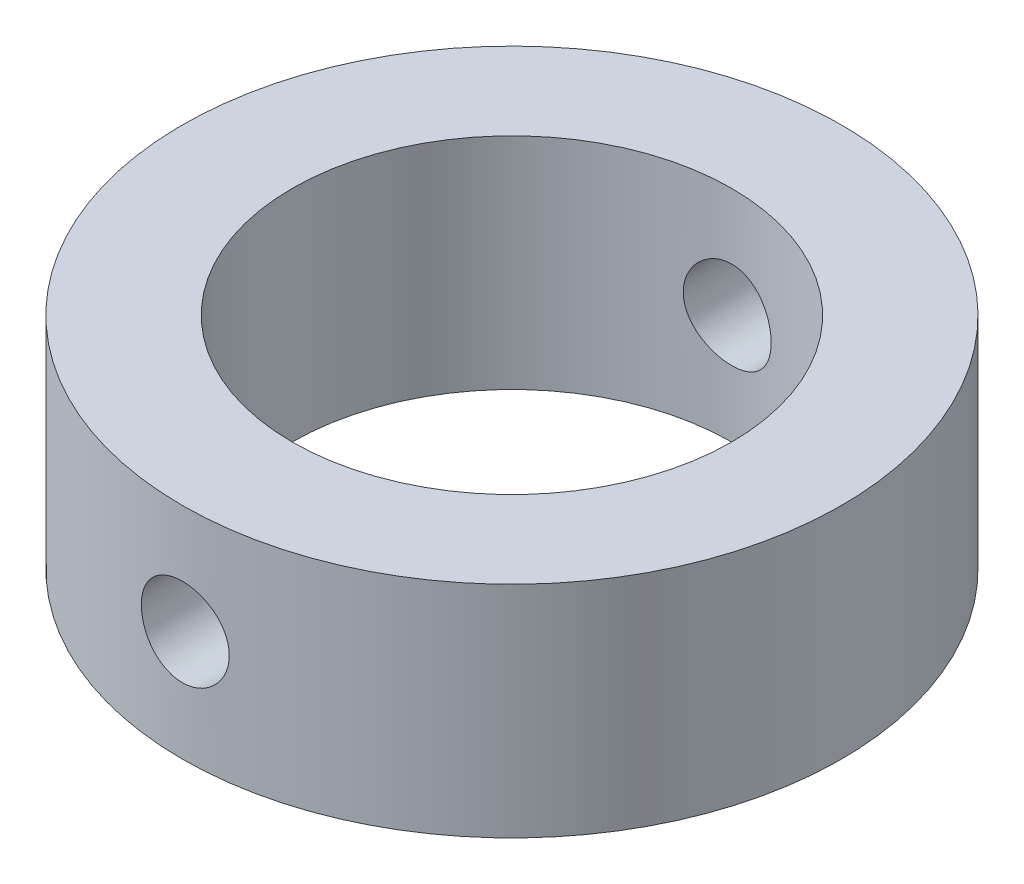
ISO-10303-21;
HEADER;
FILE_DESCRIPTION(('STEP AP214'),'2;1');
FILE_NAME('part.step','',(''),(''),'','','');
FILE_SCHEMA(('AUTOMOTIVE_DESIGN { 1 0 10303 214 1 1 1 1 }'));
ENDSEC;
DATA;
#1=APPLICATION_CONTEXT('core data for automotive mechanical design processes');
#2=APPLICATION_PROTOCOL_DEFINITION('international standard','automotive_design',2000,#1);
#3=PRODUCT_CONTEXT('',#1,'mechanical');
#4=PRODUCT('Part','Part','',(#3));
#5=PRODUCT_RELATED_PRODUCT_CATEGORY('part','',(#4));
#6=PRODUCT_DEFINITION_FORMATION('','',#4);
#7=PRODUCT_DEFINITION_CONTEXT('part definition',#1,'design');
#8=PRODUCT_DEFINITION('design','',#6,#7);
#9=PRODUCT_DEFINITION_SHAPE('','',#8);
#10=(LENGTH_UNIT() NAMED_UNIT(*) SI_UNIT(.MILLI.,.METRE.));
#11=(NAMED_UNIT(*) PLANE_ANGLE_UNIT() SI_UNIT($,.RADIAN.));
#12=(NAMED_UNIT(*) SI_UNIT($,.STERADIAN.) SOLID_ANGLE_UNIT());
#13=UNCERTAINTY_MEASURE_WITH_UNIT(LENGTH_MEASURE(1.E-05),#10,'distance_accuracy_value','');
#14=(GEOMETRIC_REPRESENTATION_CONTEXT(3) GLOBAL_UNCERTAINTY_ASSIGNED_CONTEXT((#13)) GLOBAL_UNIT_ASSIGNED_CONTEXT((#10,
#11,#12)) REPRESENTATION_CONTEXT('',''));
#15=CARTESIAN_POINT('',(0.,0.,0.));
#16=DIRECTION('',(0.,0.,1.));
#17=DIRECTION('',(1.,0.,0.));
#18=AXIS2_PLACEMENT_3D('',#15,#16,#17);
#19=CARTESIAN_POINT('',(0.,15.,0.));
#20=DIRECTION('',(0.,1.,0.));
#21=DIRECTION('',(0.,0.,1.));
#22=AXIS2_PLACEMENT_3D('',#19,#20,#21);
#23=PLANE('',#22);
#24=CARTESIAN_POINT('',(0.,15.,0.));
#25=DIRECTION('',(0.,1.,0.));
#26=DIRECTION('',(0.,0.,1.));
#27=AXIS2_PLACEMENT_3D('',#24,#25,#26);
#28=CIRCLE('',#27,22.5);
#29=CARTESIAN_POINT('',(0.,15.,22.5));
#30=VERTEX_POINT('',#29);
#31=EDGE_CURVE('E10',#30,#30,#28,.T.);
#32=ORIENTED_EDGE('',*,*,#31,.T.);
#33=EDGE_LOOP('',(#32));
#34=FACE_BOUND('',#33,.T.);
#35=CARTESIAN_POINT('',(0.,15.,0.));
#36=DIRECTION('',(0.,1.,0.));
#37=DIRECTION('',(0.,0.,1.));
#38=AXIS2_PLACEMENT_3D('',#35,#36,#37);
#39=CIRCLE('',#38,15.);
#40=CARTESIAN_POINT('',(0.,15.,15.));
#41=VERTEX_POINT('',#40);
#42=EDGE_CURVE('E56',#41,#41,#39,.T.);
#43=ORIENTED_EDGE('',*,*,#42,.F.);
#44=EDGE_LOOP('',(#43));
#45=FACE_BOUND('',#44,.T.);
#46=ADVANCED_FACE('F37',(#34,#45),#23,.T.);
#47=CARTESIAN_POINT('',(0.,0.,0.));
#48=DIRECTION('',(0.,1.,0.));
#49=DIRECTION('',(0.,0.,1.));
#50=AXIS2_PLACEMENT_3D('',#47,#48,#49);
#51=PLANE('',#50);
#52=CARTESIAN_POINT('',(0.,0.,0.));
#53=DIRECTION('',(0.,1.,0.));
#54=DIRECTION('',(0.,0.,1.));
#55=AXIS2_PLACEMENT_3D('',#52,#53,#54);
#56=CIRCLE('',#55,22.5);
#57=CARTESIAN_POINT('',(0.,0.,22.5));
#58=VERTEX_POINT('',#57);
#59=EDGE_CURVE('E51',#58,#58,#56,.T.);
#60=ORIENTED_EDGE('',*,*,#59,.F.);
#61=EDGE_LOOP('',(#60));
#62=FACE_BOUND('',#61,.T.);
#63=CARTESIAN_POINT('',(0.,0.,0.));
#64=DIRECTION('',(0.,1.,0.));
#65=DIRECTION('',(0.,0.,1.));
#66=AXIS2_PLACEMENT_3D('',#63,#64,#65);
#67=CIRCLE('',#66,15.);
#68=CARTESIAN_POINT('',(0.,0.,15.));
#69=VERTEX_POINT('',#68);
#70=EDGE_CURVE('E59',#69,#69,#67,.T.);
#71=ORIENTED_EDGE('',*,*,#70,.T.);
#72=EDGE_LOOP('',(#71));
#73=FACE_BOUND('',#72,.T.);
#74=ADVANCED_FACE('F95',(#62,#73),#51,.F.);
#75=CARTESIAN_POINT('',(0.,15.,0.));
#76=DIRECTION('',(0.,-1.,0.));
#77=DIRECTION('',(0.,0.,-1.));
#78=AXIS2_PLACEMENT_3D('',#75,#76,#77);
#79=CYLINDRICAL_SURFACE('',#78,22.5);
#80=CARTESIAN_POINT('',(0.,10.523861700092,-22.5));
#81=CARTESIAN_POINT('',(-0.167713253503927,10.5238546355317,-22.4999975361382));
#82=CARTESIAN_POINT('',(-0.33552896891442,10.5097503931483,-22.4981050609079));
#83=CARTESIAN_POINT('',(-0.666484087707118,10.4537121765177,-22.4907376669036));
#84=CARTESIAN_POINT('',(-0.829618533499555,10.4117497577463,-22.4852590866259));
#85=CARTESIAN_POINT('',(-1.14637246894048,10.3012591237799,-22.471336197736));
#86=CARTESIAN_POINT('',(-1.29999852458774,10.2327494835344,-22.4628939631646));
#87=CARTESIAN_POINT('',(-1.59354584254545,10.0711513293826,-22.4439807999059));
#88=CARTESIAN_POINT('',(-1.73346930950554,9.97806677834234,-22.4335101983785));
#89=CARTESIAN_POINT('',(-1.99653873375702,9.76934180768576,-22.4116349218495));
#90=CARTESIAN_POINT('',(-2.11958697824379,9.65357873257932,-22.4002253724317));
#91=CARTESIAN_POINT('',(-2.34457103509652,9.40304641647705,-22.3777970633693));
#92=CARTESIAN_POINT('',(-2.44650572995832,9.26827617009832,-22.3667783244351));
#93=CARTESIAN_POINT('',(-2.62673853403361,8.98291301567448,-22.3463315316028));
#94=CARTESIAN_POINT('',(-2.70494411223867,8.83226117637409,-22.3369097664864));
#95=CARTESIAN_POINT('',(-2.83490767510935,8.51981509923685,-22.3207888106885));
#96=CARTESIAN_POINT('',(-2.88666679867917,8.35802134156206,-22.3140895027681));
#97=CARTESIAN_POINT('',(-2.96196910158261,8.02890298433955,-22.30421904853));
#98=CARTESIAN_POINT('',(-2.9856780634276,7.86161694829265,-22.301027180552));
#99=CARTESIAN_POINT('',(-3.00472020822176,7.5254124306831,-22.2984697741397));
#100=CARTESIAN_POINT('',(-3.00005468450402,7.35649402387569,-22.299104061306));
#101=CARTESIAN_POINT('',(-2.96261618908852,7.02298000505013,-22.3041083365948));
#102=CARTESIAN_POINT('',(-2.93002646297642,6.85836340526347,-22.3084539693351));
#103=CARTESIAN_POINT('',(-2.83795086951557,6.5369564449519,-22.3203532916212));
#104=CARTESIAN_POINT('',(-2.77846438892186,6.38016626295951,-22.3279070543119));
#105=CARTESIAN_POINT('',(-2.63408893714787,6.07829724803123,-22.3453989166654));
#106=CARTESIAN_POINT('',(-2.54912096870624,5.93325664330057,-22.3553444118585));
#107=CARTESIAN_POINT('',(-2.35625090016434,5.65942307721554,-22.376493543299));
#108=CARTESIAN_POINT('',(-2.24834760753577,5.53063096126078,-22.3876972449529));
#109=CARTESIAN_POINT('',(-2.01165735039544,5.29188718121918,-22.4102084885038));
#110=CARTESIAN_POINT('',(-1.88271256053967,5.18209193603854,-22.421516153118));
#111=CARTESIAN_POINT('',(-1.60814125520011,4.98567863269944,-22.4428788572739));
#112=CARTESIAN_POINT('',(-1.46251469166355,4.89906064130675,-22.4529338932073));
#113=CARTESIAN_POINT('',(-1.1585883295957,4.75145802354992,-22.4706659061537));
#114=CARTESIAN_POINT('',(-1.00028336826185,4.69048390352256,-22.4783419081343));
#115=CARTESIAN_POINT('',(-0.675556386504374,4.59602772163351,-22.4904423885611));
#116=CARTESIAN_POINT('',(-0.509134799313385,4.56254419413294,-22.4948670403489));
#117=CARTESIAN_POINT('',(-0.174250354988465,4.52422405093535,-22.4999436206528));
#118=CARTESIAN_POINT('',(-0.00581255182056326,4.5191720974168,-22.5006239077357));
#119=CARTESIAN_POINT('',(0.329507425828077,4.5372891962828,-22.4982118730778));
#120=CARTESIAN_POINT('',(0.496389638018497,4.56045756276557,-22.495119643029));
#121=CARTESIAN_POINT('',(0.823220573359407,4.634178680168,-22.4855276303715));
#122=CARTESIAN_POINT('',(0.983193024768066,4.68462805257525,-22.4790407145438));
#123=CARTESIAN_POINT('',(1.29240764819034,4.81137114899766,-22.4633851388143));
#124=CARTESIAN_POINT('',(1.44164941052346,4.88766585911191,-22.4542163765916));
#125=CARTESIAN_POINT('',(1.72612331792412,5.06444993346699,-22.4341475605511));
#126=CARTESIAN_POINT('',(1.8612687215949,5.16507774866203,-22.4232377256857));
#127=CARTESIAN_POINT('',(2.11282942048784,5.38747669392841,-22.4009359306497));
#128=CARTESIAN_POINT('',(2.22924386493568,5.50924878386668,-22.3895439486093));
#129=CARTESIAN_POINT('',(2.44080824134647,5.77143141405136,-22.3674735371027));
#130=CARTESIAN_POINT('',(2.53581491413407,5.91195805019927,-22.3568002316295));
#131=CARTESIAN_POINT('',(2.70087526618221,6.20710081551342,-22.3374619950273));
#132=CARTESIAN_POINT('',(2.7709295026552,6.36171662995759,-22.3287970190518));
#133=CARTESIAN_POINT('',(2.88386754751119,6.68019756313357,-22.3144921767012));
#134=CARTESIAN_POINT('',(2.92683043270193,6.84403422790824,-22.308843513489));
#135=CARTESIAN_POINT('',(2.98462000715938,7.17667714828517,-22.3011862304744));
#136=CARTESIAN_POINT('',(2.99944820140173,7.34548313757868,-22.2991774159701));
#137=CARTESIAN_POINT('',(3.00051728709284,7.68184693637229,-22.2990334694317));
#138=CARTESIAN_POINT('',(2.98698328791739,7.84940406153839,-22.3008678342378));
#139=CARTESIAN_POINT('',(2.93219065030034,8.17983851274784,-22.308137758113));
#140=CARTESIAN_POINT('',(2.89093202224903,8.342715840545,-22.3135733158325));
#141=CARTESIAN_POINT('',(2.78193465498311,8.65912722496941,-22.3274233540915));
#142=CARTESIAN_POINT('',(2.71420831228562,8.81266561676732,-22.335836439891));
#143=CARTESIAN_POINT('',(2.55422014139606,9.10623552583112,-22.3546956856923));
#144=CARTESIAN_POINT('',(2.46195783945643,9.24626678222609,-22.365141884949));
#145=CARTESIAN_POINT('',(2.25468672764262,9.50999617498464,-22.3869895077459));
#146=CARTESIAN_POINT('',(2.13951040840351,9.63356212172472,-22.3983975863112));
#147=CARTESIAN_POINT('',(1.89003254024735,9.85969652463435,-22.4208257850249));
#148=CARTESIAN_POINT('',(1.75572651109466,9.9622600482174,-22.4318458135347));
#149=CARTESIAN_POINT('',(1.47112948177923,10.1438624077918,-22.4523095270629));
#150=CARTESIAN_POINT('',(1.32077193111595,10.2227976999249,-22.4617461964033));
#151=CARTESIAN_POINT('',(1.008888614381,10.3541825979096,-22.4779098098846));
#152=CARTESIAN_POINT('',(0.847375018454836,10.4066605630293,-22.4846396538647));
#153=CARTESIAN_POINT('',(0.57088261214763,10.4712837096698,-22.493035826149));
#154=CARTESIAN_POINT('',(0.45763662293367,10.4909715653775,-22.4956344545261));
#155=CARTESIAN_POINT('',(0.229609757424169,10.5172629213402,-22.4991173773616));
#156=CARTESIAN_POINT('',(0.114828894676861,10.5238665370124,-22.500001686942));
#157=CARTESIAN_POINT('',(0.,10.523861700092,-22.5));
#158=B_SPLINE_CURVE_WITH_KNOTS('',3,(#80,#81,#82,#83,#84,#85,#86,#87,#88,#89,#90,#91,#92,#93,
#94,#95,#96,#97,#98,#99,#100,#101,#102,#103,#104,#105,#106,#107,#108,#109,#110,#111,#112,#113,
#114,#115,#116,#117,#118,#119,#120,#121,#122,#123,#124,#125,#126,#127,#128,#129,#130,#131,#132,
#133,#134,#135,#136,#137,#138,#139,#140,#141,#142,#143,#144,#145,#146,#147,#148,#149,#150,#151,
#152,#153,#154,#155,#156,#157),.UNSPECIFIED.,.T.,.F.,(4,2,2,2,2,2,2,2,2,2,2,2,2,2,2,2,2,2,2,2,2,
2,2,2,2,2,2,2,2,2,2,2,2,2,2,2,2,2,4),(0.,0.502720276958615,1.00595464632757,1.50883753924111,
2.01163938846052,2.51723967665338,3.02286671857254,3.53044082267471,4.03799306649307,
4.54253033871538,5.0470446138738,5.54827327647065,6.04951336763776,6.55232374706847,
7.05516027665696,7.56195816727274,8.06875751778444,8.57576430303808,9.08274405587614,
9.58587877488091,10.0890012653172,10.590230450947,11.0914787625532,11.5956491215483,
12.0998423738814,12.6073155680318,13.1147774290957,13.6207511210318,14.1266977467545,
14.6286439124494,15.1305898900312,15.6323010555393,16.1340219089385,16.6395550175266,
17.1452067187674,17.6530429001177,18.1603335748863,18.5045360857096,18.8487355602816),.UNSPECIFIED.);
#159=CARTESIAN_POINT('',(0.,10.523861700092,-22.5));
#160=VERTEX_POINT('',#159);
#161=EDGE_CURVE('E84',#160,#160,#158,.T.);
#162=ORIENTED_EDGE('',*,*,#161,.T.);
#163=EDGE_LOOP('',(#162));
#164=FACE_BOUND('',#163,.T.);
#165=CARTESIAN_POINT('',(3.,7.52386170009203,22.2991031209778));
#166=CARTESIAN_POINT('',(2.99999292892183,7.3561559168898,22.2991056676806));
#167=CARTESIAN_POINT('',(2.98588990056203,7.18834765041745,22.3010154696116));
#168=CARTESIAN_POINT('',(2.92985694399183,6.85740800658844,22.3084447289533));
#169=CARTESIAN_POINT('',(2.88789854473666,6.69428159271629,22.3139678794925));
#170=CARTESIAN_POINT('',(2.77741966710399,6.37754464775249,22.3279873821811));
#171=CARTESIAN_POINT('',(2.70891795412568,6.22392748266547,22.3364816334313));
#172=CARTESIAN_POINT('',(2.54733847321029,5.9303950865277,22.3554837337772));
#173=CARTESIAN_POINT('',(2.45426464895203,5.79047766168499,22.3659912596801));
#174=CARTESIAN_POINT('',(2.24555055734277,5.52740151808932,22.3879106598111));
#175=CARTESIAN_POINT('',(2.12978523412289,5.40434240157295,22.399327327406));
#176=CARTESIAN_POINT('',(1.87924384308915,5.17933733190746,22.4217356438735));
#177=CARTESIAN_POINT('',(1.74446679970797,5.07739246287773,22.4327272708987));
#178=CARTESIAN_POINT('',(1.45909758739142,4.89714893751742,22.4530964964055));
#179=CARTESIAN_POINT('',(1.30844765656683,4.81894096615666,22.4624678475342));
#180=CARTESIAN_POINT('',(0.996005724056049,4.68897245382083,22.4784878012371));
#181=CARTESIAN_POINT('',(0.8342141908836,4.63721080152551,22.4851365182189));
#182=CARTESIAN_POINT('',(0.505103062521133,4.56190333572163,22.4949282929341));
#183=CARTESIAN_POINT('',(0.337822085204846,4.53819147757409,22.4980919730761));
#184=CARTESIAN_POINT('',(0.00162750345548436,4.5191417869868,22.5006277195727));
#185=CARTESIAN_POINT('',(-0.1672860280837,4.52380269348725,22.4999999544424));
#186=CARTESIAN_POINT('',(-0.500820186698655,4.56123379590345,22.4950401617536));
#187=CARTESIAN_POINT('',(-0.665461256042678,4.5938253972105,22.4907316700671));
#188=CARTESIAN_POINT('',(-0.986916184068833,4.68591319062429,22.4789208613843));
#189=CARTESIAN_POINT('',(-1.14372987681276,4.7454099528442,22.4714184767105));
#190=CARTESIAN_POINT('',(-1.44562771263619,4.88980686177476,22.4540222850625));
#191=CARTESIAN_POINT('',(-1.59067477402989,4.97478363486665,22.4441212821882));
#192=CARTESIAN_POINT('',(-1.86451753610218,5.16767258601631,22.4230342562856));
#193=CARTESIAN_POINT('',(-1.99331238880023,5.27558596003373,22.4118481662643));
#194=CARTESIAN_POINT('',(-2.23204509231808,5.51228347263042,22.3893388214349));
#195=CARTESIAN_POINT('',(-2.34182855029532,5.64122335238248,22.378015176366));
#196=CARTESIAN_POINT('',(-2.53822039585787,5.91578059715089,22.3565924815386));
#197=CARTESIAN_POINT('',(-2.6248286915453,6.06139802829648,22.3464934366361));
#198=CARTESIAN_POINT('',(-2.7724242912975,6.36532170061208,22.3286636450151));
#199=CARTESIAN_POINT('',(-2.8333981336006,6.52363455686976,22.3209341432218));
#200=CARTESIAN_POINT('',(-2.92785135067386,6.84837873104959,22.3087421319858));
#201=CARTESIAN_POINT('',(-2.96133224031215,7.01480960113188,22.3042794425424));
#202=CARTESIAN_POINT('',(-2.9996424115309,7.34969870259947,22.2991596751552));
#203=CARTESIAN_POINT('',(-3.00468946648218,7.51813159559083,22.2984736726744));
#204=CARTESIAN_POINT('',(-2.98656432283194,7.85344058424914,22.3009083644505));
#205=CARTESIAN_POINT('',(-2.96339281094665,8.02031671770121,22.3040289660712));
#206=CARTESIAN_POINT('',(-2.88967207555529,8.34711567970045,22.3136988065515));
#207=CARTESIAN_POINT('',(-2.8392292548504,8.50706293961919,22.3202347168148));
#208=CARTESIAN_POINT('',(-2.71250767620188,8.81623007027068,22.3359878852161));
#209=CARTESIAN_POINT('',(-2.63622789314074,8.96544951507761,22.3452052497426));
#210=CARTESIAN_POINT('',(-2.45946609625816,9.24990766575325,22.3653516992928));
#211=CARTESIAN_POINT('',(-2.3588418474945,9.38505727264438,22.376290706837));
#212=CARTESIAN_POINT('',(-2.13644748469198,9.63662810774766,22.3986171527477));
#213=CARTESIAN_POINT('',(-2.01467643215631,9.75304850431405,22.410004610999));
#214=CARTESIAN_POINT('',(-1.75249132253736,9.9646265309737,22.43203422983));
#215=CARTESIAN_POINT('',(-1.61196096139879,10.0596406746494,22.4426710507457));
#216=CARTESIAN_POINT('',(-1.31680867847643,10.224714123355,22.4619201221745));
#217=CARTESIAN_POINT('',(-1.16218707377055,10.2947739897262,22.4705324182274));
#218=CARTESIAN_POINT('',(-0.84370915878515,10.4077155924742,22.4847384703673));
#219=CARTESIAN_POINT('',(-0.679882176371043,10.4506788437174,22.4903412723117));
#220=CARTESIAN_POINT('',(-0.347259740134796,10.5084724282835,22.4979347502993));
#221=CARTESIAN_POINT('',(-0.178464543299731,10.5233042141536,22.499925612842));
#222=CARTESIAN_POINT('',(0.157904810567381,10.5243841009525,22.5000697087262));
#223=CARTESIAN_POINT('',(0.32547828888281,10.5108529059836,22.4982525737009));
#224=CARTESIAN_POINT('',(0.655946164578541,10.456060138244,22.4910439982984));
#225=CARTESIAN_POINT('',(0.818840568511611,10.41479860431,22.485652562927));
#226=CARTESIAN_POINT('',(1.13528735188325,10.3057886294771,22.4718983496352));
#227=CARTESIAN_POINT('',(1.28884395231572,10.2380522604803,22.4635369261179));
#228=CARTESIAN_POINT('',(1.58244611794646,10.0780383756231,22.4447662409466));
#229=CARTESIAN_POINT('',(1.72249143359931,9.98576040661219,22.4343569414803));
#230=CARTESIAN_POINT('',(1.98622092909954,9.77847167708775,22.4125543681221));
#231=CARTESIAN_POINT('',(2.10977573574388,9.66329701488771,22.4011543544026));
#232=CARTESIAN_POINT('',(2.33588843381036,9.41382709651652,22.3787079735476));
#233=CARTESIAN_POINT('',(2.43844136296137,9.27952733419345,22.3676616905097));
#234=CARTESIAN_POINT('',(2.62003186467116,8.99493578774986,22.3471216479154));
#235=CARTESIAN_POINT('',(2.69896410641012,8.84457631288409,22.337634925064));
#236=CARTESIAN_POINT('',(2.83034277419568,8.5326889988739,22.3213704974611));
#237=CARTESIAN_POINT('',(2.88281759498929,8.37117334546765,22.3145898900774));
#238=CARTESIAN_POINT('',(2.94743220568238,8.0946892819962,22.3061270075485));
#239=CARTESIAN_POINT('',(2.96711622203802,7.98145429063778,22.3035064293224));
#240=CARTESIAN_POINT('',(2.99340248014674,7.75344943588831,22.2999936221278));
#241=CARTESIAN_POINT('',(3.00000484113448,7.63867958649655,22.2991013774062));
#242=CARTESIAN_POINT('',(3.,7.52386170009203,22.2991031209778));
#243=B_SPLINE_CURVE_WITH_KNOTS('',3,(#165,#166,#167,#168,#169,#170,#171,#172,#173,#174,#175,
#176,#177,#178,#179,#180,#181,#182,#183,#184,#185,#186,#187,#188,#189,#190,#191,#192,#193,#194,
#195,#196,#197,#198,#199,#200,#201,#202,#203,#204,#205,#206,#207,#208,#209,#210,#211,#212,#213,
#214,#215,#216,#217,#218,#219,#220,#221,#222,#223,#224,#225,#226,#227,#228,#229,#230,#231,#232,
#233,#234,#235,#236,#237,#238,#239,#240,#241,#242),.UNSPECIFIED.,.T.,.F.,(4,2,2,2,2,2,2,2,2,2,2,
2,2,2,2,2,2,2,2,2,2,2,2,2,2,2,2,2,2,2,2,2,2,2,2,2,2,2,4),(0.,0.502697833875675,1.00591026915852,
1.50876759415237,2.01154426252435,2.51717392681748,3.02282954643357,3.5303933478772,
4.03793581885392,4.54245854287453,5.04695884297284,5.54825713004929,6.04956604000018,
6.55239792684377,7.05525603876943,7.56202372603438,8.06879342278636,8.57582891483611,
9.08283646723653,9.58595553872895,10.0890623667531,10.5902202722789,11.0913980642731,
11.595577922135,12.0997801612593,12.6072676764676,13.1147437751273,13.620685856555,
14.1266018133322,14.6285956478445,15.1305887793096,15.6323532802529,16.1341270467162,
16.6396311355341,17.145254526141,17.6531001297407,18.1603995347189,18.5045691141841,
18.8487355566505),.UNSPECIFIED.);
#244=CARTESIAN_POINT('',(3.,7.52386170009203,22.2991031209778));
#245=VERTEX_POINT('',#244);
#246=EDGE_CURVE('E79',#245,#245,#243,.T.);
#247=ORIENTED_EDGE('',*,*,#246,.T.);
#248=EDGE_LOOP('',(#247));
#249=FACE_BOUND('',#248,.T.);
#250=ORIENTED_EDGE('',*,*,#31,.F.);
#251=EDGE_LOOP('',(#250));
#252=FACE_BOUND('',#251,.T.);
#253=ORIENTED_EDGE('',*,*,#59,.T.);
#254=EDGE_LOOP('',(#253));
#255=FACE_BOUND('',#254,.T.);
#256=ADVANCED_FACE('F39',(#164,#249,#252,#255),#79,.T.);
#257=CARTESIAN_POINT('',(0.,15.,0.));
#258=DIRECTION('',(0.,-1.,0.));
#259=DIRECTION('',(0.,0.,-1.));
#260=AXIS2_PLACEMENT_3D('',#257,#258,#259);
#261=CYLINDRICAL_SURFACE('',#260,15.);
#262=CARTESIAN_POINT('',(0.,10.523861700092,-15.));
#263=CARTESIAN_POINT('',(-0.1667307203779,10.523855566597,-14.9999969274261));
#264=CARTESIAN_POINT('',(-0.333538980604567,10.5099151711891,-14.9971915553469));
#265=CARTESIAN_POINT('',(-0.662440523067058,10.4545661997463,-14.9862709686969));
#266=CARTESIAN_POINT('',(-0.824529952624068,10.4131358016875,-14.9781515358056));
#267=CARTESIAN_POINT('',(-1.13919091578994,10.3041378792297,-14.9575094783486));
#268=CARTESIAN_POINT('',(-1.2917714037994,10.236595389558,-14.9449910723015));
#269=CARTESIAN_POINT('',(-1.58342396659268,10.0773649575581,-14.9169119410594));
#270=CARTESIAN_POINT('',(-1.72249684522744,9.98567845327041,-14.9013513970712));
#271=CARTESIAN_POINT('',(-1.9850804319446,9.77944621721773,-14.8686649598991));
#272=CARTESIAN_POINT('',(-2.10838185347557,9.66463663391842,-14.8515223651304));
#273=CARTESIAN_POINT('',(-2.33411026982409,9.41598445091692,-14.8177254135776));
#274=CARTESIAN_POINT('',(-2.43653563431127,9.28214036608667,-14.8010710950127));
#275=CARTESIAN_POINT('',(-2.61849526004286,8.9977131210564,-14.7699732543785));
#276=CARTESIAN_POINT('',(-2.6978128165976,8.84698876870295,-14.7555512209484));
#277=CARTESIAN_POINT('',(-2.82991699974092,8.53401624307979,-14.7307880417525));
#278=CARTESIAN_POINT('',(-2.88270624731171,8.371769210053,-14.7204464928588));
#279=CARTESIAN_POINT('',(-2.95957589965448,8.04260860836828,-14.7051841575661));
#280=CARTESIAN_POINT('',(-2.98402349387633,7.87578406766535,-14.7001941032156));
#281=CARTESIAN_POINT('',(-3.00465638317836,7.540332235999,-14.6959912518188));
#282=CARTESIAN_POINT('',(-3.0008445681405,7.37170513113159,-14.6967778640352));
#283=CARTESIAN_POINT('',(-2.96536371930546,7.04012133602902,-14.7039765344455));
#284=CARTESIAN_POINT('',(-2.93411562073172,6.87711748321009,-14.7103035857629));
#285=CARTESIAN_POINT('',(-2.84531365386915,6.55871347010302,-14.7277363848));
#286=CARTESIAN_POINT('',(-2.78775852930204,6.40331367333501,-14.7388423607334));
#287=CARTESIAN_POINT('',(-2.64757435102416,6.10331591498123,-14.7646685550122));
#288=CARTESIAN_POINT('',(-2.56477845369634,5.95879806138451,-14.7794126944111));
#289=CARTESIAN_POINT('',(-2.37658072371804,5.68554915017359,-14.8108385631919));
#290=CARTESIAN_POINT('',(-2.27117629307049,5.55681990953856,-14.827520515151));
#291=CARTESIAN_POINT('',(-2.03849980368175,5.31637349272122,-14.8613106372439));
#292=CARTESIAN_POINT('',(-1.91086848363733,5.20500399651464,-14.8784210763271));
#293=CARTESIAN_POINT('',(-1.63855507218603,5.00520016118836,-14.9108654614323));
#294=CARTESIAN_POINT('',(-1.49387276213817,4.91676611621129,-14.9261993846692));
#295=CARTESIAN_POINT('',(-1.19117816063676,4.7652791724141,-14.9534007048266));
#296=CARTESIAN_POINT('',(-1.0331454587559,4.70226601915842,-14.9652626654482));
#297=CARTESIAN_POINT('',(-0.708446929345993,4.60378027797633,-14.9841422696357));
#298=CARTESIAN_POINT('',(-0.541782150217349,4.56830435387114,-14.9911605000159));
#299=CARTESIAN_POINT('',(-0.207538216881451,4.5263923387092,-14.999480156006));
#300=CARTESIAN_POINT('',(-0.0400209849767287,4.51948044147122,-15.0008752395741));
#301=CARTESIAN_POINT('',(0.293774802578142,4.53361127691857,-14.9980515579031));
#302=CARTESIAN_POINT('',(0.46005342733138,4.55465243814982,-14.9938331082434));
#303=CARTESIAN_POINT('',(0.785116979839623,4.6236968207239,-14.9803149602405));
#304=CARTESIAN_POINT('',(0.943955845019709,4.67145590558574,-14.9710612921262));
#305=CARTESIAN_POINT('',(1.251370882499,4.79231364805946,-14.948506561831));
#306=CARTESIAN_POINT('',(1.39994628491262,4.86541420412252,-14.9352051964268));
#307=CARTESIAN_POINT('',(1.68462352105865,5.03590917204597,-14.9057973459988));
#308=CARTESIAN_POINT('',(1.82055038025656,5.13359004320887,-14.8896585131116));
#309=CARTESIAN_POINT('',(2.07425405735762,5.35008927371387,-14.8564420448965));
#310=CARTESIAN_POINT('',(2.19202892679229,5.46890989929163,-14.8393643090516));
#311=CARTESIAN_POINT('',(2.40792177232253,5.7264817557654,-14.8058791067089));
#312=CARTESIAN_POINT('',(2.50571310734597,5.86550893275604,-14.7894858069991));
#313=CARTESIAN_POINT('',(2.67655626015362,6.15829578416207,-14.7595257538858));
#314=CARTESIAN_POINT('',(2.74960906776871,6.31205486881269,-14.7459588874003));
#315=CARTESIAN_POINT('',(2.86845552474588,6.62916643854067,-14.7233022175315));
#316=CARTESIAN_POINT('',(2.91439049937315,6.79246422372299,-14.7141892461656));
#317=CARTESIAN_POINT('',(2.97812595488159,7.12466206056474,-14.7014231037608));
#318=CARTESIAN_POINT('',(2.99593010467534,7.29356137872007,-14.6977692207333));
#319=CARTESIAN_POINT('',(3.00276273260241,7.62888829372498,-14.6963744889414));
#320=CARTESIAN_POINT('',(2.99230736421269,7.79530514687306,-14.698527575679));
#321=CARTESIAN_POINT('',(2.94405691230018,8.12395664980711,-14.7082672045384));
#322=CARTESIAN_POINT('',(2.90626204838789,8.28619133317644,-14.7158537030151));
#323=CARTESIAN_POINT('',(2.80463570549686,8.60154483381366,-14.7355579265748));
#324=CARTESIAN_POINT('',(2.74086752015203,8.75468478159928,-14.7476646305649));
#325=CARTESIAN_POINT('',(2.58916393380481,9.04817286229535,-14.7750514492251));
#326=CARTESIAN_POINT('',(2.50122650632465,9.18851992126744,-14.7903318299668));
#327=CARTESIAN_POINT('',(2.30191774435924,9.45500841654297,-14.8226688156968));
#328=CARTESIAN_POINT('',(2.19017366170554,9.58086799589482,-14.839751187291));
#329=CARTESIAN_POINT('',(1.94719310703942,9.81222031667954,-14.8735824561586));
#330=CARTESIAN_POINT('',(1.81595216146,9.91770837104385,-14.8903312758955));
#331=CARTESIAN_POINT('',(1.53605288726474,10.1063656319314,-14.9218149716391));
#332=CARTESIAN_POINT('',(1.3872266532895,10.1892897099321,-14.9365269365774));
#333=CARTESIAN_POINT('',(1.0774990828222,10.3288200678818,-14.96205375255));
#334=CARTESIAN_POINT('',(0.916608782589378,10.3854500686895,-14.9728721141585));
#335=CARTESIAN_POINT('',(0.629464466771338,10.4598175442262,-14.9872911778611));
#336=CARTESIAN_POINT('',(0.504844992041354,10.4837912812153,-14.9920290947535));
#337=CARTESIAN_POINT('',(0.253498575630201,10.5158154371671,-14.9983846241968));
#338=CARTESIAN_POINT('',(0.126771701245857,10.5238663636213,-15.0000023361946));
#339=CARTESIAN_POINT('',(0.,10.523861700092,-15.));
#340=B_SPLINE_CURVE_WITH_KNOTS('',3,(#262,#263,#264,#265,#266,#267,#268,#269,#270,#271,#272,
#273,#274,#275,#276,#277,#278,#279,#280,#281,#282,#283,#284,#285,#286,#287,#288,#289,#290,#291,
#292,#293,#294,#295,#296,#297,#298,#299,#300,#301,#302,#303,#304,#305,#306,#307,#308,#309,#310,
#311,#312,#313,#314,#315,#316,#317,#318,#319,#320,#321,#322,#323,#324,#325,#326,#327,#328,#329,
#330,#331,#332,#333,#334,#335,#336,#337,#338,#339),.UNSPECIFIED.,.T.,.F.,(4,2,2,2,2,2,2,2,2,2,2,
2,2,2,2,2,2,2,2,2,2,2,2,2,2,2,2,2,2,2,2,2,2,2,2,2,2,2,4),(0.,0.499728391983776,0.99985395207397,
1.49950120575103,1.99911870669259,2.50479801033656,3.0105167902421,3.52083585017768,
4.03110448095592,4.53468555310762,5.03821512843675,5.53415181018835,6.03011217761189,
6.52942470610778,7.02879464249011,7.53714757474052,8.04550702619461,8.55465824562072,
9.06374777094108,9.56432207028795,10.064868229736,10.5609136185217,11.0569961764807,
11.5591519810008,12.0613616503779,12.5712188573768,13.081055661704,13.5882114309817,
14.0953010499124,14.593191677031,15.0910783047783,15.5877588375933,16.084481027456,
16.5896422871743,17.0949196359879,17.6054849002691,18.1155886655256,18.4955632586968,
18.8755257411299),.UNSPECIFIED.);
#341=CARTESIAN_POINT('',(0.,10.523861700092,-15.));
#342=VERTEX_POINT('',#341);
#343=EDGE_CURVE('E42',#342,#342,#340,.T.);
#344=ORIENTED_EDGE('',*,*,#343,.F.);
#345=EDGE_LOOP('',(#344));
#346=FACE_BOUND('',#345,.T.);
#347=CARTESIAN_POINT('',(3.,7.52386170009203,14.6969384566991));
#348=CARTESIAN_POINT('',(2.99999383762581,7.35716857361856,14.6969417707994));
#349=CARTESIAN_POINT('',(2.98605951515443,7.19039783009201,14.6998052480611));
#350=CARTESIAN_POINT('',(2.93073685074852,6.86157418466263,14.7109329391462));
#351=CARTESIAN_POINT('',(2.88932654121148,6.69952516618409,14.7192014743436));
#352=CARTESIAN_POINT('',(2.78038734785924,6.3849497900294,14.7401662116556));
#353=CARTESIAN_POINT('',(2.71288444245786,6.23241413549426,14.7528580086323));
#354=CARTESIAN_POINT('',(2.55374732301151,5.94083716600116,14.7812339844198));
#355=CARTESIAN_POINT('',(2.46211445580345,5.80179509847832,14.7969179962038));
#356=CARTESIAN_POINT('',(2.25593722696031,5.53917868853045,14.8297589908276));
#357=CARTESIAN_POINT('',(2.14111696773996,5.41582293644011,14.8469321351174));
#358=CARTESIAN_POINT('',(1.89242036706393,5.18998909935509,14.880674169078));
#359=CARTESIAN_POINT('',(1.75854269093395,5.08751247784045,14.8972430163249));
#360=CARTESIAN_POINT('',(1.47408406777277,4.90549764720665,14.9280838925269));
#361=CARTESIAN_POINT('',(1.32336770301663,4.82616715864211,14.9423346432465));
#362=CARTESIAN_POINT('',(1.01041245116182,4.69403688894762,14.9667521065089));
#363=CARTESIAN_POINT('',(0.84817464426166,4.64123462438906,14.9769192013236));
#364=CARTESIAN_POINT('',(0.519050319835484,4.56434011923315,14.9919096206526));
#365=CARTESIAN_POINT('',(0.352253217644444,4.53987876737901,14.9968015886438));
#366=CARTESIAN_POINT('',(0.0168557053126103,4.51920884457708,15.0009276355081));
#367=CARTESIAN_POINT('',(-0.151744529495528,4.52299755115456,15.0001622595828));
#368=CARTESIAN_POINT('',(-0.483426002230765,4.55844024073869,14.9931130460555));
#369=CARTESIAN_POINT('',(-0.646551642895409,4.58969663159557,14.9869079509751));
#370=CARTESIAN_POINT('',(-0.965194879740902,4.67855679746871,14.9697653147823));
#371=CARTESIAN_POINT('',(-1.12071217124139,4.73616162666765,14.9588275843212));
#372=CARTESIAN_POINT('',(-1.42085838960266,4.87645182053383,14.9333188805988));
#373=CARTESIAN_POINT('',(-1.5654125224017,4.95929295340669,14.9187254452567));
#374=CARTESIAN_POINT('',(-1.83871513757927,5.14758893180183,14.8875140842136));
#375=CARTESIAN_POINT('',(-1.967461798575,5.25304637940358,14.8708959256567));
#376=CARTESIAN_POINT('',(-2.20785429316037,5.48576256641744,14.8371289309338));
#377=CARTESIAN_POINT('',(-2.31916294972089,5.6133692602808,14.8199758937255));
#378=CARTESIAN_POINT('',(-2.51885547953042,5.88561102744428,14.7873471479628));
#379=CARTESIAN_POINT('',(-2.60723891918325,6.03024642274162,14.7718714711364));
#380=CARTESIAN_POINT('',(-2.75868844440564,6.33292419555744,14.7443414241877));
#381=CARTESIAN_POINT('',(-2.82169994333313,6.49099460301101,14.7322944469065));
#382=CARTESIAN_POINT('',(-2.92017102488275,6.815775671264,14.7130942896382));
#383=CARTESIAN_POINT('',(-2.95563419836993,6.98248520294928,14.7059404718528));
#384=CARTESIAN_POINT('',(-2.99749801810815,7.31675627408916,14.6974643780348));
#385=CARTESIAN_POINT('',(-3.00438557669374,7.48425442302305,14.6960444117146));
#386=CARTESIAN_POINT('',(-2.99021288493222,7.81800636969108,14.6989345706656));
#387=CARTESIAN_POINT('',(-2.96915421936733,7.98426023744862,14.7032443710116));
#388=CARTESIAN_POINT('',(-2.90010662422247,8.30916762096874,14.7170169748474));
#389=CARTESIAN_POINT('',(-2.8523778625179,8.46787872919932,14.7264299704349));
#390=CARTESIAN_POINT('',(-2.73162310592555,8.77505153717825,14.7493046805499));
#391=CARTESIAN_POINT('',(-2.65859502711953,8.92351239139919,14.7627667285881));
#392=CARTESIAN_POINT('',(-2.48821242664679,9.20810102994251,14.7924421788612));
#393=CARTESIAN_POINT('',(-2.39055323394826,9.34404283899451,14.8086891559471));
#394=CARTESIAN_POINT('',(-2.17408671663814,9.59778663609478,14.8420117147991));
#395=CARTESIAN_POINT('',(-2.05527721543361,9.71558675483979,14.8590873817145));
#396=CARTESIAN_POINT('',(-1.79769682049367,9.93154937764876,14.8924603760765));
#397=CARTESIAN_POINT('',(-1.65864749678889,10.029382664042,14.9087417312605));
#398=CARTESIAN_POINT('',(-1.36580368990427,10.2002993445908,14.9384138288586));
#399=CARTESIAN_POINT('',(-1.21200982630052,10.2733837781264,14.9518046926563));
#400=CARTESIAN_POINT('',(-0.894908042472039,10.3922483153319,14.974118821832));
#401=CARTESIAN_POINT('',(-0.731660020434236,10.4381832547708,14.9830673742781));
#402=CARTESIAN_POINT('',(-0.399568364039737,10.5019354430836,14.9955970781298));
#403=CARTESIAN_POINT('',(-0.230725406133636,10.5197560785191,14.9991788759955));
#404=CARTESIAN_POINT('',(0.104618681710862,10.5266426429807,15.0005562136234));
#405=CARTESIAN_POINT('',(0.27110943642448,10.5162035414607,14.9984513564799));
#406=CARTESIAN_POINT('',(0.599913093946948,10.4679598484485,14.9889013068102));
#407=CARTESIAN_POINT('',(0.762226049261166,10.4301556010476,14.9814561814329));
#408=CARTESIAN_POINT('',(1.07775824923519,10.3284747238173,14.9620649509476));
#409=CARTESIAN_POINT('',(1.23099732972049,10.2646575656991,14.9501291174284));
#410=CARTESIAN_POINT('',(1.52466366055821,10.1128249760987,14.9230416637104));
#411=CARTESIAN_POINT('',(1.66508989730354,10.0248076323785,14.9078897894096));
#412=CARTESIAN_POINT('',(1.93159167031775,9.82540353890818,14.8757279747022));
#413=CARTESIAN_POINT('',(2.05739914834453,9.71366269094071,14.858692002537));
#414=CARTESIAN_POINT('',(2.28864785327552,9.47071097979572,14.8248366872359));
#415=CARTESIAN_POINT('',(2.39408424962674,9.33949551165225,14.8080173963616));
#416=CARTESIAN_POINT('',(2.58267665834994,9.05962375002074,14.7763002820179));
#417=CARTESIAN_POINT('',(2.66558044385427,8.91079481672827,14.7614251071368));
#418=CARTESIAN_POINT('',(2.80507214779868,8.60106338031173,14.7355571137924));
#419=CARTESIAN_POINT('',(2.86168393792249,8.44017198403046,14.7245607757495));
#420=CARTESIAN_POINT('',(2.93600741957297,8.15307433376341,14.7098904341354));
#421=CARTESIAN_POINT('',(2.95996169557105,8.02850544155016,14.7050635474382));
#422=CARTESIAN_POINT('',(2.99196005387913,7.77725983643862,14.6985863537725));
#423=CARTESIAN_POINT('',(3.00000468468793,7.65058319635862,14.6969359372925));
#424=CARTESIAN_POINT('',(3.,7.52386170009203,14.6969384566991));
#425=B_SPLINE_CURVE_WITH_KNOTS('',3,(#347,#348,#349,#350,#351,#352,#353,#354,#355,#356,#357,
#358,#359,#360,#361,#362,#363,#364,#365,#366,#367,#368,#369,#370,#371,#372,#373,#374,#375,#376,
#377,#378,#379,#380,#381,#382,#383,#384,#385,#386,#387,#388,#389,#390,#391,#392,#393,#394,#395,
#396,#397,#398,#399,#400,#401,#402,#403,#404,#405,#406,#407,#408,#409,#410,#411,#412,#413,#414,
#415,#416,#417,#418,#419,#420,#421,#422,#423,#424),.UNSPECIFIED.,.T.,.F.,(4,2,2,2,2,2,2,2,2,2,2,
2,2,2,2,2,2,2,2,2,2,2,2,2,2,2,2,2,2,2,2,2,2,2,2,2,2,2,4),(0.,0.499615391608283,
0.999630717852889,1.49914949382176,1.99864039457959,2.5044675764531,3.01033020106266,
3.5206020131235,4.03082604739679,4.53432746649241,5.03778036348745,5.53406368900612,
6.03036687221251,6.52979772666909,7.02928607310198,7.5374804028745,8.04568434368161,
8.5549758951833,9.06420105048074,9.5647127341378,10.0651960358526,10.5608802534996,
11.0566053106319,11.5587917932356,12.0610299861063,12.5709780520035,13.0809046989031,
13.5878944073595,14.0948230407488,14.5929305224406,15.0910317410027,15.5880005122636,
16.0850085640405,16.5900345607679,17.0951801666934,17.6057669573882,18.1158892527059,
18.4957141091448,18.8755258705644),.UNSPECIFIED.);
#426=CARTESIAN_POINT('',(3.,7.52386170009203,14.6969384566991));
#427=VERTEX_POINT('',#426);
#428=EDGE_CURVE('E61',#427,#427,#425,.T.);
#429=ORIENTED_EDGE('',*,*,#428,.F.);
#430=EDGE_LOOP('',(#429));
#431=FACE_BOUND('',#430,.T.);
#432=ORIENTED_EDGE('',*,*,#42,.T.);
#433=EDGE_LOOP('',(#432));
#434=FACE_BOUND('',#433,.T.);
#435=ORIENTED_EDGE('',*,*,#70,.F.);
#436=EDGE_LOOP('',(#435));
#437=FACE_BOUND('',#436,.T.);
#438=ADVANCED_FACE('F66',(#346,#431,#434,#437),#261,.F.);
#439=CARTESIAN_POINT('',(0.,7.52386170009203,-42.5));
#440=DIRECTION('',(0.,0.,1.));
#441=DIRECTION('',(1.,0.,0.));
#442=AXIS2_PLACEMENT_3D('',#439,#440,#441);
#443=CYLINDRICAL_SURFACE('',#442,3.);
#444=ORIENTED_EDGE('',*,*,#428,.T.);
#445=EDGE_LOOP('',(#444));
#446=FACE_BOUND('',#445,.T.);
#447=ORIENTED_EDGE('',*,*,#246,.F.);
#448=EDGE_LOOP('',(#447));
#449=FACE_BOUND('',#448,.T.);
#450=ADVANCED_FACE('F72',(#446,#449),#443,.F.);
#451=ORIENTED_EDGE('',*,*,#343,.T.);
#452=EDGE_LOOP('',(#451));
#453=FACE_BOUND('',#452,.T.);
#454=ORIENTED_EDGE('',*,*,#161,.F.);
#455=EDGE_LOOP('',(#454));
#456=FACE_BOUND('',#455,.T.);
#457=ADVANCED_FACE('F69',(#453,#456),#443,.F.);
#458=CLOSED_SHELL('',(#46,#74,#256,#438,#450,#457));
#459=MANIFOLD_SOLID_BREP('B2',#458);
#460=ADVANCED_BREP_SHAPE_REPRESENTATION('',(#18,#459),#14);
#461=SHAPE_DEFINITION_REPRESENTATION(#9,#460);
ENDSEC;
END-ISO-10303-21;
